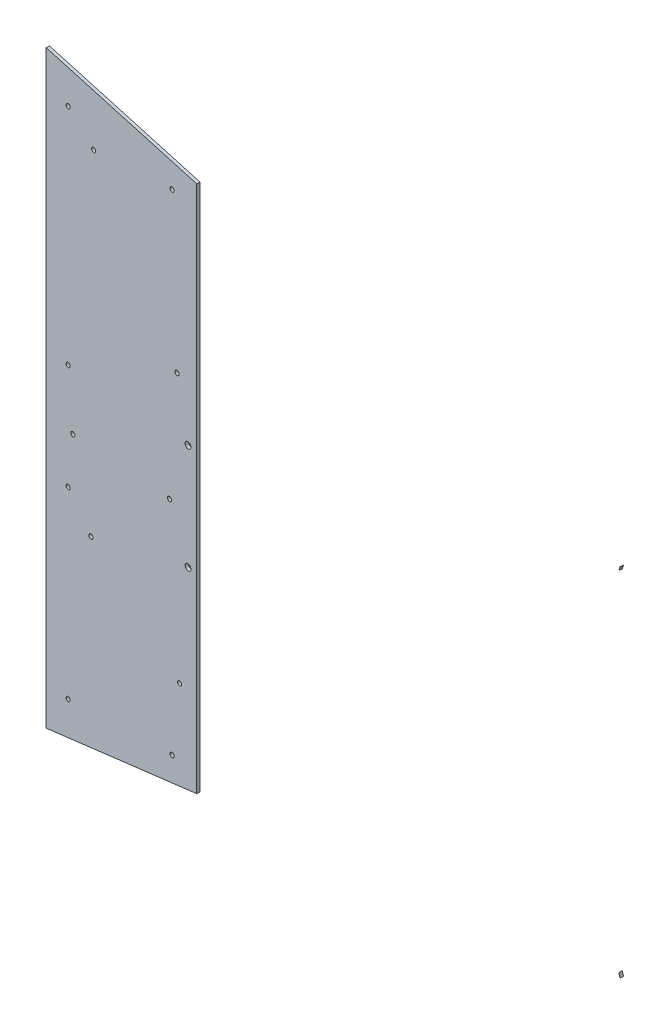
ISO-10303-21;
HEADER;
FILE_DESCRIPTION(('STEP AP214'),'2;1');
FILE_NAME('part.step','',(''),(''),'','','');
FILE_SCHEMA(('AUTOMOTIVE_DESIGN { 1 0 10303 214 1 1 1 1 }'));
ENDSEC;
DATA;
#1=APPLICATION_CONTEXT('core data for automotive mechanical design processes');
#2=APPLICATION_PROTOCOL_DEFINITION('international standard','automotive_design',2000,#1);
#3=PRODUCT_CONTEXT('',#1,'mechanical');
#4=PRODUCT('Part','Part','',(#3));
#5=PRODUCT_RELATED_PRODUCT_CATEGORY('part','',(#4));
#6=PRODUCT_DEFINITION_FORMATION('','',#4);
#7=PRODUCT_DEFINITION_CONTEXT('part definition',#1,'design');
#8=PRODUCT_DEFINITION('design','',#6,#7);
#9=PRODUCT_DEFINITION_SHAPE('','',#8);
#10=(LENGTH_UNIT() NAMED_UNIT(*) SI_UNIT(.MILLI.,.METRE.));
#11=(NAMED_UNIT(*) PLANE_ANGLE_UNIT() SI_UNIT($,.RADIAN.));
#12=(NAMED_UNIT(*) SI_UNIT($,.STERADIAN.) SOLID_ANGLE_UNIT());
#13=UNCERTAINTY_MEASURE_WITH_UNIT(LENGTH_MEASURE(1.E-05),#10,'distance_accuracy_value','');
#14=(GEOMETRIC_REPRESENTATION_CONTEXT(3) GLOBAL_UNCERTAINTY_ASSIGNED_CONTEXT((#13)) GLOBAL_UNIT_ASSIGNED_CONTEXT((#10,
#11,#12)) REPRESENTATION_CONTEXT('',''));
#15=CARTESIAN_POINT('',(0.,0.,0.));
#16=DIRECTION('',(0.,0.,1.));
#17=DIRECTION('',(1.,0.,0.));
#18=AXIS2_PLACEMENT_3D('',#15,#16,#17);
#19=CARTESIAN_POINT('',(2.18546483713156,0.,-29.4309264733717));
#20=DIRECTION('',(-0.0740535347134658,0.,0.99725426747467));
#21=DIRECTION('',(0.997254267474671,0.,0.0740535347134658));
#22=AXIS2_PLACEMENT_3D('',#19,#20,#21);
#23=PLANE('',#22);
#24=CARTESIAN_POINT('',(340.473432525948,33.,-4.31053283311297));
#25=DIRECTION('',(-0.0740535347134658,0.,0.99725426747467));
#26=DIRECTION('',(0.997254267474671,0.,0.0740535347134658));
#27=AXIS2_PLACEMENT_3D('',#24,#25,#26);
#28=CIRCLE('',#27,3.17499999999997);
#29=CARTESIAN_POINT('',(343.63971482518,33.,-4.07541286039772));
#30=VERTEX_POINT('',#29);
#31=EDGE_CURVE('E390',#30,#30,#28,.T.);
#32=ORIENTED_EDGE('',*,*,#31,.T.);
#33=EDGE_LOOP('',(#32));
#34=FACE_BOUND('',#33,.T.);
#35=CARTESIAN_POINT('',(340.473432525948,-74.,-4.31053283311297));
#36=DIRECTION('',(-0.0740535347134658,0.,0.99725426747467));
#37=DIRECTION('',(0.997254267474671,0.,0.0740535347134658));
#38=AXIS2_PLACEMENT_3D('',#35,#36,#37);
#39=CIRCLE('',#38,3.17499999999997);
#40=CARTESIAN_POINT('',(343.63971482518,-74.,-4.07541286039772));
#41=VERTEX_POINT('',#40);
#42=EDGE_CURVE('E391',#41,#41,#39,.T.);
#43=ORIENTED_EDGE('',*,*,#42,.T.);
#44=EDGE_LOOP('',(#43));
#45=FACE_BOUND('',#44,.T.);
#46=CARTESIAN_POINT('',(323.021224904554,248.051870805116,-5.60648884460266));
#47=DIRECTION('',(0.0740535347134658,0.,-0.997254267474671));
#48=DIRECTION('',(-0.997254267474671,0.,-0.0740535347134658));
#49=AXIS2_PLACEMENT_3D('',#46,#47,#48);
#50=CIRCLE('',#49,2.24999999999997);
#51=CARTESIAN_POINT('',(320.777402802736,248.051870805116,-5.77310929770796));
#52=VERTEX_POINT('',#51);
#53=EDGE_CURVE('E169',#52,#52,#50,.T.);
#54=ORIENTED_EDGE('',*,*,#53,.F.);
#55=EDGE_LOOP('',(#54));
#56=FACE_BOUND('',#55,.T.);
#57=CARTESIAN_POINT('',(209.334496353029,260.,-14.0485726479337));
#58=DIRECTION('',(0.0740535347134658,0.,-0.997254267474671));
#59=DIRECTION('',(-0.997254267474671,0.,-0.0740535347134658));
#60=AXIS2_PLACEMENT_3D('',#57,#58,#59);
#61=CIRCLE('',#60,2.24999999999997);
#62=CARTESIAN_POINT('',(207.090674251211,260.,-14.215193101039));
#63=VERTEX_POINT('',#62);
#64=EDGE_CURVE('E159',#63,#63,#61,.T.);
#65=ORIENTED_EDGE('',*,*,#64,.F.);
#66=EDGE_LOOP('',(#65));
#67=FACE_BOUND('',#66,.T.);
#68=CARTESIAN_POINT('',(209.334496353029,33.,-14.0485726479337));
#69=DIRECTION('',(0.0740535347134658,0.,-0.997254267474671));
#70=DIRECTION('',(-0.997254267474671,0.,-0.0740535347134658));
#71=AXIS2_PLACEMENT_3D('',#68,#69,#70);
#72=CIRCLE('',#71,2.25);
#73=CARTESIAN_POINT('',(207.090674251211,33.,-14.215193101039));
#74=VERTEX_POINT('',#73);
#75=EDGE_CURVE('E156',#74,#74,#72,.T.);
#76=ORIENTED_EDGE('',*,*,#75,.F.);
#77=EDGE_LOOP('',(#76));
#78=FACE_BOUND('',#77,.T.);
#79=CARTESIAN_POINT('',(209.334496353029,-260.,-14.0485726479337));
#80=DIRECTION('',(0.0740535347134658,0.,-0.997254267474671));
#81=DIRECTION('',(-0.997254267474671,0.,-0.0740535347134658));
#82=AXIS2_PLACEMENT_3D('',#79,#80,#81);
#83=CIRCLE('',#82,2.24999999999997);
#84=CARTESIAN_POINT('',(207.090674251211,-260.,-14.215193101039));
#85=VERTEX_POINT('',#84);
#86=EDGE_CURVE('E153',#85,#85,#83,.T.);
#87=ORIENTED_EDGE('',*,*,#86,.F.);
#88=EDGE_LOOP('',(#87));
#89=FACE_BOUND('',#88,.T.);
#90=CARTESIAN_POINT('',(209.334496353029,-74.,-14.0485726479337));
#91=DIRECTION('',(0.0740535347134658,0.,-0.997254267474671));
#92=DIRECTION('',(-0.997254267474671,0.,-0.0740535347134658));
#93=AXIS2_PLACEMENT_3D('',#90,#91,#92);
#94=CIRCLE('',#93,2.25);
#95=CARTESIAN_POINT('',(207.090674251211,-74.,-14.215193101039));
#96=VERTEX_POINT('',#95);
#97=EDGE_CURVE('E149',#96,#96,#94,.T.);
#98=ORIENTED_EDGE('',*,*,#97,.F.);
#99=EDGE_LOOP('',(#98));
#100=FACE_BOUND('',#99,.T.);
#101=CARTESIAN_POINT('',(323.021224904554,-248.051870805116,-5.60648884460266));
#102=DIRECTION('',(0.0740535347134658,0.,-0.997254267474671));
#103=DIRECTION('',(-0.997254267474671,0.,-0.0740535347134658));
#104=AXIS2_PLACEMENT_3D('',#101,#102,#103);
#105=CIRCLE('',#104,2.25);
#106=CARTESIAN_POINT('',(320.777402802736,-248.051870805116,-5.77310929770796));
#107=VERTEX_POINT('',#106);
#108=EDGE_CURVE('E145',#107,#107,#105,.T.);
#109=ORIENTED_EDGE('',*,*,#108,.F.);
#110=EDGE_LOOP('',(#109));
#111=FACE_BOUND('',#110,.T.);
#112=CARTESIAN_POINT('',(331.286227586838,-180.725,-4.99275102166076));
#113=DIRECTION('',(0.0740535347134658,0.,-0.997254267474671));
#114=DIRECTION('',(-0.997254267474671,0.,-0.0740535347134658));
#115=AXIS2_PLACEMENT_3D('',#112,#113,#114);
#116=CIRCLE('',#115,2.25);
#117=CARTESIAN_POINT('',(329.04240548502,-180.725,-5.15937147476606));
#118=VERTEX_POINT('',#117);
#119=EDGE_CURVE('E141',#118,#118,#116,.T.);
#120=ORIENTED_EDGE('',*,*,#119,.F.);
#121=EDGE_LOOP('',(#120));
#122=FACE_BOUND('',#121,.T.);
#123=CARTESIAN_POINT('',(234.191058969835,-104.,-12.2027882952006));
#124=DIRECTION('',(0.0740535347134658,0.,-0.997254267474671));
#125=DIRECTION('',(-0.997254267474671,0.,-0.0740535347134658));
#126=AXIS2_PLACEMENT_3D('',#123,#124,#125);
#127=CIRCLE('',#126,2.25);
#128=CARTESIAN_POINT('',(231.947236868017,-104.,-12.3694087483059));
#129=VERTEX_POINT('',#128);
#130=EDGE_CURVE('E137',#129,#129,#127,.T.);
#131=ORIENTED_EDGE('',*,*,#130,.F.);
#132=EDGE_LOOP('',(#131));
#133=FACE_BOUND('',#132,.T.);
#134=CARTESIAN_POINT('',(320.204239539525,-25.,-5.81567092616417));
#135=DIRECTION('',(0.0740535347134658,0.,-0.997254267474671));
#136=DIRECTION('',(-0.997254267474671,0.,-0.0740535347134658));
#137=AXIS2_PLACEMENT_3D('',#134,#135,#136);
#138=CIRCLE('',#137,2.25);
#139=CARTESIAN_POINT('',(317.960417437707,-25.,-5.98229137926947));
#140=VERTEX_POINT('',#139);
#141=EDGE_CURVE('E133',#140,#140,#138,.T.);
#142=ORIENTED_EDGE('',*,*,#141,.F.);
#143=EDGE_LOOP('',(#142));
#144=FACE_BOUND('',#143,.T.);
#145=CARTESIAN_POINT('',(214.49528718721,-25.,-13.6653456057915));
#146=DIRECTION('',(0.0740535347134658,0.,-0.997254267474671));
#147=DIRECTION('',(-0.997254267474671,0.,-0.0740535347134658));
#148=AXIS2_PLACEMENT_3D('',#145,#146,#147);
#149=CIRCLE('',#148,2.25);
#150=CARTESIAN_POINT('',(212.251465085392,-25.,-13.8319660588968));
#151=VERTEX_POINT('',#150);
#152=EDGE_CURVE('E129',#151,#151,#149,.T.);
#153=ORIENTED_EDGE('',*,*,#152,.F.);
#154=EDGE_LOOP('',(#153));
#155=FACE_BOUND('',#154,.T.);
#156=CARTESIAN_POINT('',(237.182821772259,236.6,-11.9806276910602));
#157=DIRECTION('',(0.0740535347134658,0.,-0.997254267474671));
#158=DIRECTION('',(-0.997254267474671,0.,-0.0740535347134658));
#159=AXIS2_PLACEMENT_3D('',#156,#157,#158);
#160=CIRCLE('',#159,2.25);
#161=CARTESIAN_POINT('',(234.938999670441,236.6,-12.1472481441655));
#162=VERTEX_POINT('',#161);
#163=EDGE_CURVE('E125',#162,#162,#160,.T.);
#164=ORIENTED_EDGE('',*,*,#163,.F.);
#165=EDGE_LOOP('',(#164));
#166=FACE_BOUND('',#165,.T.);
#167=DIRECTION('',(0.980155318065139,-0.184385653893442,0.0727838107474114));
#168=VECTOR('',#167,1.);
#169=CARTESIAN_POINT('',(826.675599863577,177.8,31.7935885038397));
#170=LINE('',#169,#168);
#171=CARTESIAN_POINT('',(185.325599863576,298.45,-15.8314114961604));
#172=VERTEX_POINT('',#171);
#173=CARTESIAN_POINT('',(349.972279423644,267.476862260977,-3.60517291496721));
#174=VERTEX_POINT('',#173);
#175=EDGE_CURVE('E111',#172,#174,#170,.T.);
#176=ORIENTED_EDGE('',*,*,#175,.T.);
#177=DIRECTION('',(0.,-1.,0.));
#178=VECTOR('',#177,1.);
#179=CARTESIAN_POINT('',(349.972279423644,0.,-3.6051729149672));
#180=LINE('',#179,#178);
#181=CARTESIAN_POINT('',(349.972279423644,-267.476862260977,-3.6051729149672));
#182=VERTEX_POINT('',#181);
#183=EDGE_CURVE('E69',#174,#182,#180,.T.);
#184=ORIENTED_EDGE('',*,*,#183,.T.);
#185=DIRECTION('',(-0.980155318065139,-0.184385653893442,-0.0727838107474114));
#186=VECTOR('',#185,1.);
#187=CARTESIAN_POINT('',(185.325599863576,-298.45,-15.8314114961604));
#188=LINE('',#187,#186);
#189=CARTESIAN_POINT('',(185.325599863576,-298.45,-15.8314114961604));
#190=VERTEX_POINT('',#189);
#191=EDGE_CURVE('E98',#182,#190,#188,.T.);
#192=ORIENTED_EDGE('',*,*,#191,.T.);
#193=DIRECTION('',(0.,1.,0.));
#194=VECTOR('',#193,1.);
#195=CARTESIAN_POINT('',(185.325599863576,-298.45,-15.8314114961604));
#196=LINE('',#195,#194);
#197=EDGE_CURVE('E99',#190,#172,#196,.T.);
#198=ORIENTED_EDGE('',*,*,#197,.T.);
#199=EDGE_LOOP('',(#176,#184,#192,#198));
#200=FACE_BOUND('',#199,.T.);
#201=CARTESIAN_POINT('',(328.431587246192,90.,-5.20472926477805));
#202=DIRECTION('',(0.0740535347134658,0.,-0.997254267474671));
#203=DIRECTION('',(-0.997254267474671,0.,-0.0740535347134658));
#204=AXIS2_PLACEMENT_3D('',#201,#202,#203);
#205=CIRCLE('',#204,2.25);
#206=CARTESIAN_POINT('',(326.187765144374,90.,-5.37134971788335));
#207=VERTEX_POINT('',#206);
#208=EDGE_CURVE('E121',#207,#207,#205,.T.);
#209=ORIENTED_EDGE('',*,*,#208,.F.);
#210=EDGE_LOOP('',(#209));
#211=FACE_BOUND('',#210,.T.);
#212=ADVANCED_FACE('F50',(#34,#45,#56,#67,#78,#89,#100,#111,#122,#133,#144,#155,#166,#200,#211),
#23,.F.);
#213=CARTESIAN_POINT('',(826.675599863577,177.8,31.7935885038397));
#214=DIRECTION('',(-0.183879380206342,-0.982853972184214,-0.0136544094212631));
#215=DIRECTION('',(0.982945608068834,-0.183896524105788,0.));
#216=AXIS2_PLACEMENT_3D('',#213,#214,#215);
#217=PLANE('',#216);
#218=DIRECTION('',(0.980155318065139,-0.184385653893442,0.0727838107474114));
#219=VECTOR('',#218,1.);
#220=CARTESIAN_POINT('',(826.440479890861,177.8,34.9598708030718));
#221=LINE('',#220,#219);
#222=CARTESIAN_POINT('',(185.090479890861,298.45,-12.6651291969283));
#223=VERTEX_POINT('',#222);
#224=CARTESIAN_POINT('',(349.737159450929,267.476862260977,-0.438890615735127));
#225=VERTEX_POINT('',#224);
#226=EDGE_CURVE('E120',#223,#225,#221,.T.);
#227=ORIENTED_EDGE('',*,*,#226,.T.);
#228=DIRECTION('',(-0.0740535347134658,0.,0.99725426747467));
#229=VECTOR('',#228,1.);
#230=CARTESIAN_POINT('',(353.489395366027,267.476862260977,-50.9690009390479));
#231=LINE('',#230,#229);
#232=EDGE_CURVE('E60',#174,#225,#231,.T.);
#233=ORIENTED_EDGE('',*,*,#232,.F.);
#234=ORIENTED_EDGE('',*,*,#175,.F.);
#235=DIRECTION('',(-0.0740535347134658,0.,0.99725426747467));
#236=VECTOR('',#235,1.);
#237=CARTESIAN_POINT('',(185.325599863576,298.45,-15.8314114961604));
#238=LINE('',#237,#236);
#239=EDGE_CURVE('E115',#172,#223,#238,.T.);
#240=ORIENTED_EDGE('',*,*,#239,.T.);
#241=EDGE_LOOP('',(#227,#233,#234,#240));
#242=FACE_BOUND('',#241,.T.);
#243=ADVANCED_FACE('F194',(#242),#217,.F.);
#244=CARTESIAN_POINT('',(185.325599863576,-298.45,-15.8314114961604));
#245=DIRECTION('',(-0.183879380206342,0.982853972184214,-0.0136544094212631));
#246=DIRECTION('',(-0.982945608068834,-0.183896524105788,0.));
#247=AXIS2_PLACEMENT_3D('',#244,#245,#246);
#248=PLANE('',#247);
#249=ORIENTED_EDGE('',*,*,#191,.F.);
#250=DIRECTION('',(-0.0740535347134658,0.,0.99725426747467));
#251=VECTOR('',#250,1.);
#252=CARTESIAN_POINT('',(353.489395366027,-267.476862260977,-50.9690009390479));
#253=LINE('',#252,#251);
#254=CARTESIAN_POINT('',(349.737159450929,-267.476862260977,-0.438890615735142));
#255=VERTEX_POINT('',#254);
#256=EDGE_CURVE('E88',#182,#255,#253,.T.);
#257=ORIENTED_EDGE('',*,*,#256,.T.);
#258=DIRECTION('',(-0.980155318065139,-0.184385653893442,-0.0727838107474114));
#259=VECTOR('',#258,1.);
#260=CARTESIAN_POINT('',(185.090479890861,-298.45,-12.6651291969283));
#261=LINE('',#260,#259);
#262=CARTESIAN_POINT('',(185.090479890861,-298.45,-12.6651291969283));
#263=VERTEX_POINT('',#262);
#264=EDGE_CURVE('E96',#255,#263,#261,.T.);
#265=ORIENTED_EDGE('',*,*,#264,.T.);
#266=DIRECTION('',(-0.0740535347134658,0.,0.99725426747467));
#267=VECTOR('',#266,1.);
#268=CARTESIAN_POINT('',(185.325599863576,-298.45,-15.8314114961604));
#269=LINE('',#268,#267);
#270=EDGE_CURVE('E105',#190,#263,#269,.T.);
#271=ORIENTED_EDGE('',*,*,#270,.F.);
#272=EDGE_LOOP('',(#249,#257,#265,#271));
#273=FACE_BOUND('',#272,.T.);
#274=ADVANCED_FACE('F52',(#273),#248,.F.);
#275=CARTESIAN_POINT('',(185.325599863576,-298.45,-15.8314114961604));
#276=DIRECTION('',(0.99725426747467,0.,0.0740535347134658));
#277=DIRECTION('',(0.0740535347134658,0.,-0.99725426747467));
#278=AXIS2_PLACEMENT_3D('',#275,#276,#277);
#279=PLANE('',#278);
#280=DIRECTION('',(0.,1.,0.));
#281=VECTOR('',#280,1.);
#282=CARTESIAN_POINT('',(185.090479890861,-298.45,-12.6651291969283));
#283=LINE('',#282,#281);
#284=EDGE_CURVE('E102',#263,#223,#283,.T.);
#285=ORIENTED_EDGE('',*,*,#284,.T.);
#286=ORIENTED_EDGE('',*,*,#239,.F.);
#287=ORIENTED_EDGE('',*,*,#197,.F.);
#288=ORIENTED_EDGE('',*,*,#270,.T.);
#289=EDGE_LOOP('',(#285,#286,#287,#288));
#290=FACE_BOUND('',#289,.T.);
#291=ADVANCED_FACE('F199',(#290),#279,.F.);
#292=CARTESIAN_POINT('',(1.95034486441631,0.,-26.2646441741396));
#293=DIRECTION('',(-0.0740535347134658,0.,0.99725426747467));
#294=DIRECTION('',(0.997254267474671,0.,0.0740535347134658));
#295=AXIS2_PLACEMENT_3D('',#292,#293,#294);
#296=PLANE('',#295);
#297=CARTESIAN_POINT('',(340.238312553233,33.,-1.1442505338809));
#298=DIRECTION('',(-0.0740535347134658,0.,0.997254267474671));
#299=DIRECTION('',(0.997254267474671,0.,0.0740535347134658));
#300=AXIS2_PLACEMENT_3D('',#297,#298,#299);
#301=CIRCLE('',#300,3.17499999999997);
#302=CARTESIAN_POINT('',(343.404594852465,33.,-0.909130561165653));
#303=VERTEX_POINT('',#302);
#304=EDGE_CURVE('E387',#303,#303,#301,.T.);
#305=ORIENTED_EDGE('',*,*,#304,.F.);
#306=EDGE_LOOP('',(#305));
#307=FACE_BOUND('',#306,.T.);
#308=CARTESIAN_POINT('',(340.238312553233,-74.,-1.1442505338809));
#309=DIRECTION('',(-0.0740535347134658,0.,0.997254267474671));
#310=DIRECTION('',(0.997254267474671,0.,0.0740535347134658));
#311=AXIS2_PLACEMENT_3D('',#308,#309,#310);
#312=CIRCLE('',#311,3.17499999999997);
#313=CARTESIAN_POINT('',(343.404594852465,-74.,-0.909130561165653));
#314=VERTEX_POINT('',#313);
#315=EDGE_CURVE('E396',#314,#314,#312,.T.);
#316=ORIENTED_EDGE('',*,*,#315,.F.);
#317=EDGE_LOOP('',(#316));
#318=FACE_BOUND('',#317,.T.);
#319=CARTESIAN_POINT('',(322.786104931838,248.051870805116,-2.44020654537057));
#320=DIRECTION('',(-0.0740535347134658,0.,0.99725426747467));
#321=DIRECTION('',(0.997254267474671,0.,0.0740535347134658));
#322=AXIS2_PLACEMENT_3D('',#319,#320,#321);
#323=CIRCLE('',#322,2.24999999999997);
#324=CARTESIAN_POINT('',(325.029927033656,248.051870805116,-2.27358609226528));
#325=VERTEX_POINT('',#324);
#326=EDGE_CURVE('E54',#325,#325,#323,.T.);
#327=ORIENTED_EDGE('',*,*,#326,.F.);
#328=EDGE_LOOP('',(#327));
#329=FACE_BOUND('',#328,.T.);
#330=CARTESIAN_POINT('',(209.099376380314,260.,-10.8822903487016));
#331=DIRECTION('',(-0.0740535347134658,0.,0.99725426747467));
#332=DIRECTION('',(0.997254267474671,0.,0.0740535347134658));
#333=AXIS2_PLACEMENT_3D('',#330,#331,#332);
#334=CIRCLE('',#333,2.24999999999997);
#335=CARTESIAN_POINT('',(211.343198482132,260.,-10.7156698955963));
#336=VERTEX_POINT('',#335);
#337=EDGE_CURVE('E157',#336,#336,#334,.T.);
#338=ORIENTED_EDGE('',*,*,#337,.F.);
#339=EDGE_LOOP('',(#338));
#340=FACE_BOUND('',#339,.T.);
#341=CARTESIAN_POINT('',(209.099376380314,33.,-10.8822903487016));
#342=DIRECTION('',(-0.0740535347134658,0.,0.99725426747467));
#343=DIRECTION('',(0.997254267474671,0.,0.0740535347134658));
#344=AXIS2_PLACEMENT_3D('',#341,#342,#343);
#345=CIRCLE('',#344,2.25);
#346=CARTESIAN_POINT('',(211.343198482132,33.,-10.7156698955963));
#347=VERTEX_POINT('',#346);
#348=EDGE_CURVE('E154',#347,#347,#345,.T.);
#349=ORIENTED_EDGE('',*,*,#348,.F.);
#350=EDGE_LOOP('',(#349));
#351=FACE_BOUND('',#350,.T.);
#352=CARTESIAN_POINT('',(209.099376380314,-260.,-10.8822903487016));
#353=DIRECTION('',(-0.0740535347134658,0.,0.99725426747467));
#354=DIRECTION('',(0.997254267474671,0.,0.0740535347134658));
#355=AXIS2_PLACEMENT_3D('',#352,#353,#354);
#356=CIRCLE('',#355,2.24999999999997);
#357=CARTESIAN_POINT('',(211.343198482132,-260.,-10.7156698955963));
#358=VERTEX_POINT('',#357);
#359=EDGE_CURVE('E150',#358,#358,#356,.T.);
#360=ORIENTED_EDGE('',*,*,#359,.F.);
#361=EDGE_LOOP('',(#360));
#362=FACE_BOUND('',#361,.T.);
#363=CARTESIAN_POINT('',(209.099376380314,-74.,-10.8822903487016));
#364=DIRECTION('',(-0.0740535347134658,0.,0.99725426747467));
#365=DIRECTION('',(0.997254267474671,0.,0.0740535347134658));
#366=AXIS2_PLACEMENT_3D('',#363,#364,#365);
#367=CIRCLE('',#366,2.25);
#368=CARTESIAN_POINT('',(211.343198482132,-74.,-10.7156698955963));
#369=VERTEX_POINT('',#368);
#370=EDGE_CURVE('E146',#369,#369,#367,.T.);
#371=ORIENTED_EDGE('',*,*,#370,.F.);
#372=EDGE_LOOP('',(#371));
#373=FACE_BOUND('',#372,.T.);
#374=CARTESIAN_POINT('',(322.786104931838,-248.051870805116,-2.44020654537057));
#375=DIRECTION('',(-0.0740535347134658,0.,0.99725426747467));
#376=DIRECTION('',(0.997254267474671,0.,0.0740535347134658));
#377=AXIS2_PLACEMENT_3D('',#374,#375,#376);
#378=CIRCLE('',#377,2.25);
#379=CARTESIAN_POINT('',(325.029927033656,-248.051870805116,-2.27358609226527));
#380=VERTEX_POINT('',#379);
#381=EDGE_CURVE('E142',#380,#380,#378,.T.);
#382=ORIENTED_EDGE('',*,*,#381,.F.);
#383=EDGE_LOOP('',(#382));
#384=FACE_BOUND('',#383,.T.);
#385=CARTESIAN_POINT('',(331.051107614123,-180.725,-1.82646872242868));
#386=DIRECTION('',(-0.0740535347134658,0.,0.99725426747467));
#387=DIRECTION('',(0.997254267474671,0.,0.0740535347134658));
#388=AXIS2_PLACEMENT_3D('',#385,#386,#387);
#389=CIRCLE('',#388,2.25);
#390=CARTESIAN_POINT('',(333.294929715941,-180.725,-1.65984826932338));
#391=VERTEX_POINT('',#390);
#392=EDGE_CURVE('E138',#391,#391,#389,.T.);
#393=ORIENTED_EDGE('',*,*,#392,.F.);
#394=EDGE_LOOP('',(#393));
#395=FACE_BOUND('',#394,.T.);
#396=CARTESIAN_POINT('',(233.95593899712,-104.,-9.03650599596849));
#397=DIRECTION('',(-0.0740535347134658,0.,0.99725426747467));
#398=DIRECTION('',(0.997254267474671,0.,0.0740535347134658));
#399=AXIS2_PLACEMENT_3D('',#396,#397,#398);
#400=CIRCLE('',#399,2.25);
#401=CARTESIAN_POINT('',(236.199761098938,-104.,-8.86988554286319));
#402=VERTEX_POINT('',#401);
#403=EDGE_CURVE('E134',#402,#402,#400,.T.);
#404=ORIENTED_EDGE('',*,*,#403,.F.);
#405=EDGE_LOOP('',(#404));
#406=FACE_BOUND('',#405,.T.);
#407=CARTESIAN_POINT('',(319.96911956681,-25.,-2.64938862693208));
#408=DIRECTION('',(-0.0740535347134658,0.,0.99725426747467));
#409=DIRECTION('',(0.997254267474671,0.,0.0740535347134658));
#410=AXIS2_PLACEMENT_3D('',#407,#408,#409);
#411=CIRCLE('',#410,2.25);
#412=CARTESIAN_POINT('',(322.212941668628,-25.,-2.48276817382679));
#413=VERTEX_POINT('',#412);
#414=EDGE_CURVE('E130',#413,#413,#411,.T.);
#415=ORIENTED_EDGE('',*,*,#414,.F.);
#416=EDGE_LOOP('',(#415));
#417=FACE_BOUND('',#416,.T.);
#418=CARTESIAN_POINT('',(214.260167214495,-25.,-10.4990633065595));
#419=DIRECTION('',(-0.0740535347134658,0.,0.99725426747467));
#420=DIRECTION('',(0.997254267474671,0.,0.0740535347134658));
#421=AXIS2_PLACEMENT_3D('',#418,#419,#420);
#422=CIRCLE('',#421,2.25);
#423=CARTESIAN_POINT('',(216.503989316313,-25.,-10.3324428534542));
#424=VERTEX_POINT('',#423);
#425=EDGE_CURVE('E126',#424,#424,#422,.T.);
#426=ORIENTED_EDGE('',*,*,#425,.F.);
#427=EDGE_LOOP('',(#426));
#428=FACE_BOUND('',#427,.T.);
#429=CARTESIAN_POINT('',(236.947701799544,236.6,-8.81434539182809));
#430=DIRECTION('',(-0.0740535347134658,0.,0.99725426747467));
#431=DIRECTION('',(0.997254267474671,0.,0.0740535347134658));
#432=AXIS2_PLACEMENT_3D('',#429,#430,#431);
#433=CIRCLE('',#432,2.25);
#434=CARTESIAN_POINT('',(239.191523901362,236.6,-8.64772493872279));
#435=VERTEX_POINT('',#434);
#436=EDGE_CURVE('E122',#435,#435,#433,.T.);
#437=ORIENTED_EDGE('',*,*,#436,.F.);
#438=EDGE_LOOP('',(#437));
#439=FACE_BOUND('',#438,.T.);
#440=CARTESIAN_POINT('',(328.196467273476,90.,-2.03844696554597));
#441=DIRECTION('',(-0.0740535347134658,0.,0.99725426747467));
#442=DIRECTION('',(0.997254267474671,0.,0.0740535347134658));
#443=AXIS2_PLACEMENT_3D('',#440,#441,#442);
#444=CIRCLE('',#443,2.25);
#445=CARTESIAN_POINT('',(330.440289375294,90.,-1.87182651244067));
#446=VERTEX_POINT('',#445);
#447=EDGE_CURVE('E117',#446,#446,#444,.T.);
#448=ORIENTED_EDGE('',*,*,#447,.F.);
#449=EDGE_LOOP('',(#448));
#450=FACE_BOUND('',#449,.T.);
#451=DIRECTION('',(0.,-1.,0.));
#452=VECTOR('',#451,1.);
#453=CARTESIAN_POINT('',(349.737159450929,0.,-0.438890615735141));
#454=LINE('',#453,#452);
#455=EDGE_CURVE('E12',#225,#255,#454,.T.);
#456=ORIENTED_EDGE('',*,*,#455,.F.);
#457=ORIENTED_EDGE('',*,*,#226,.F.);
#458=ORIENTED_EDGE('',*,*,#284,.F.);
#459=ORIENTED_EDGE('',*,*,#264,.F.);
#460=EDGE_LOOP('',(#456,#457,#458,#459));
#461=FACE_BOUND('',#460,.T.);
#462=ADVANCED_FACE('F101',(#307,#318,#329,#340,#351,#362,#373,#384,#395,#406,#417,#428,#439,
#450,#461),#296,.T.);
#463=CARTESIAN_POINT('',(353.489395366027,0.,-50.9690009390479));
#464=DIRECTION('',(-0.99725426747467,0.,-0.0740535347134658));
#465=DIRECTION('',(-0.0740535347134658,0.,0.997254267474671));
#466=AXIS2_PLACEMENT_3D('',#463,#464,#465);
#467=PLANE('',#466);
#468=ORIENTED_EDGE('',*,*,#232,.T.);
#469=ORIENTED_EDGE('',*,*,#455,.T.);
#470=ORIENTED_EDGE('',*,*,#256,.F.);
#471=ORIENTED_EDGE('',*,*,#183,.F.);
#472=EDGE_LOOP('',(#468,#469,#470,#471));
#473=FACE_BOUND('',#472,.T.);
#474=ADVANCED_FACE('F87',(#473),#467,.F.);
#475=CARTESIAN_POINT('',(328.431587246192,90.,-5.20472926477805));
#476=DIRECTION('',(0.0740535347134658,0.,-0.997254267474671));
#477=DIRECTION('',(-0.997254267474671,0.,-0.0740535347134658));
#478=AXIS2_PLACEMENT_3D('',#475,#476,#477);
#479=CYLINDRICAL_SURFACE('',#478,2.25);
#480=ORIENTED_EDGE('',*,*,#447,.T.);
#481=EDGE_LOOP('',(#480));
#482=FACE_BOUND('',#481,.T.);
#483=ORIENTED_EDGE('',*,*,#208,.T.);
#484=EDGE_LOOP('',(#483));
#485=FACE_BOUND('',#484,.T.);
#486=ADVANCED_FACE('F206',(#482,#485),#479,.F.);
#487=CARTESIAN_POINT('',(237.182821772259,236.6,-11.9806276910602));
#488=DIRECTION('',(0.0740535347134658,0.,-0.997254267474671));
#489=DIRECTION('',(-0.997254267474671,0.,-0.0740535347134658));
#490=AXIS2_PLACEMENT_3D('',#487,#488,#489);
#491=CYLINDRICAL_SURFACE('',#490,2.25);
#492=ORIENTED_EDGE('',*,*,#436,.T.);
#493=EDGE_LOOP('',(#492));
#494=FACE_BOUND('',#493,.T.);
#495=ORIENTED_EDGE('',*,*,#163,.T.);
#496=EDGE_LOOP('',(#495));
#497=FACE_BOUND('',#496,.T.);
#498=ADVANCED_FACE('F208',(#494,#497),#491,.F.);
#499=CARTESIAN_POINT('',(214.49528718721,-25.,-13.6653456057915));
#500=DIRECTION('',(0.0740535347134658,0.,-0.997254267474671));
#501=DIRECTION('',(-0.997254267474671,0.,-0.0740535347134658));
#502=AXIS2_PLACEMENT_3D('',#499,#500,#501);
#503=CYLINDRICAL_SURFACE('',#502,2.25);
#504=ORIENTED_EDGE('',*,*,#425,.T.);
#505=EDGE_LOOP('',(#504));
#506=FACE_BOUND('',#505,.T.);
#507=ORIENTED_EDGE('',*,*,#152,.T.);
#508=EDGE_LOOP('',(#507));
#509=FACE_BOUND('',#508,.T.);
#510=ADVANCED_FACE('F215',(#506,#509),#503,.F.);
#511=CARTESIAN_POINT('',(320.204239539525,-25.,-5.81567092616417));
#512=DIRECTION('',(0.0740535347134658,0.,-0.997254267474671));
#513=DIRECTION('',(-0.997254267474671,0.,-0.0740535347134658));
#514=AXIS2_PLACEMENT_3D('',#511,#512,#513);
#515=CYLINDRICAL_SURFACE('',#514,2.25);
#516=ORIENTED_EDGE('',*,*,#414,.T.);
#517=EDGE_LOOP('',(#516));
#518=FACE_BOUND('',#517,.T.);
#519=ORIENTED_EDGE('',*,*,#141,.T.);
#520=EDGE_LOOP('',(#519));
#521=FACE_BOUND('',#520,.T.);
#522=ADVANCED_FACE('F274',(#518,#521),#515,.F.);
#523=CARTESIAN_POINT('',(234.191058969835,-104.,-12.2027882952006));
#524=DIRECTION('',(0.0740535347134658,0.,-0.997254267474671));
#525=DIRECTION('',(-0.997254267474671,0.,-0.0740535347134658));
#526=AXIS2_PLACEMENT_3D('',#523,#524,#525);
#527=CYLINDRICAL_SURFACE('',#526,2.25);
#528=ORIENTED_EDGE('',*,*,#403,.T.);
#529=EDGE_LOOP('',(#528));
#530=FACE_BOUND('',#529,.T.);
#531=ORIENTED_EDGE('',*,*,#130,.T.);
#532=EDGE_LOOP('',(#531));
#533=FACE_BOUND('',#532,.T.);
#534=ADVANCED_FACE('F283',(#530,#533),#527,.F.);
#535=CARTESIAN_POINT('',(331.286227586838,-180.725,-4.99275102166076));
#536=DIRECTION('',(0.0740535347134658,0.,-0.997254267474671));
#537=DIRECTION('',(-0.997254267474671,0.,-0.0740535347134658));
#538=AXIS2_PLACEMENT_3D('',#535,#536,#537);
#539=CYLINDRICAL_SURFACE('',#538,2.25);
#540=ORIENTED_EDGE('',*,*,#392,.T.);
#541=EDGE_LOOP('',(#540));
#542=FACE_BOUND('',#541,.T.);
#543=ORIENTED_EDGE('',*,*,#119,.T.);
#544=EDGE_LOOP('',(#543));
#545=FACE_BOUND('',#544,.T.);
#546=ADVANCED_FACE('F293',(#542,#545),#539,.F.);
#547=CARTESIAN_POINT('',(323.021224904554,-248.051870805116,-5.60648884460266));
#548=DIRECTION('',(0.0740535347134658,0.,-0.997254267474671));
#549=DIRECTION('',(-0.997254267474671,0.,-0.0740535347134658));
#550=AXIS2_PLACEMENT_3D('',#547,#548,#549);
#551=CYLINDRICAL_SURFACE('',#550,2.25);
#552=ORIENTED_EDGE('',*,*,#381,.T.);
#553=EDGE_LOOP('',(#552));
#554=FACE_BOUND('',#553,.T.);
#555=ORIENTED_EDGE('',*,*,#108,.T.);
#556=EDGE_LOOP('',(#555));
#557=FACE_BOUND('',#556,.T.);
#558=ADVANCED_FACE('F303',(#554,#557),#551,.F.);
#559=CARTESIAN_POINT('',(209.334496353029,-74.,-14.0485726479337));
#560=DIRECTION('',(0.0740535347134658,0.,-0.997254267474671));
#561=DIRECTION('',(-0.997254267474671,0.,-0.0740535347134658));
#562=AXIS2_PLACEMENT_3D('',#559,#560,#561);
#563=CYLINDRICAL_SURFACE('',#562,2.25);
#564=ORIENTED_EDGE('',*,*,#370,.T.);
#565=EDGE_LOOP('',(#564));
#566=FACE_BOUND('',#565,.T.);
#567=ORIENTED_EDGE('',*,*,#97,.T.);
#568=EDGE_LOOP('',(#567));
#569=FACE_BOUND('',#568,.T.);
#570=ADVANCED_FACE('F313',(#566,#569),#563,.F.);
#571=CARTESIAN_POINT('',(209.334496353029,-260.,-14.0485726479337));
#572=DIRECTION('',(0.0740535347134658,0.,-0.997254267474671));
#573=DIRECTION('',(-0.997254267474671,0.,-0.0740535347134658));
#574=AXIS2_PLACEMENT_3D('',#571,#572,#573);
#575=CYLINDRICAL_SURFACE('',#574,2.24999999999997);
#576=ORIENTED_EDGE('',*,*,#359,.T.);
#577=EDGE_LOOP('',(#576));
#578=FACE_BOUND('',#577,.T.);
#579=ORIENTED_EDGE('',*,*,#86,.T.);
#580=EDGE_LOOP('',(#579));
#581=FACE_BOUND('',#580,.T.);
#582=ADVANCED_FACE('F323',(#578,#581),#575,.F.);
#583=CARTESIAN_POINT('',(209.334496353029,33.,-14.0485726479337));
#584=DIRECTION('',(0.0740535347134658,0.,-0.997254267474671));
#585=DIRECTION('',(-0.997254267474671,0.,-0.0740535347134658));
#586=AXIS2_PLACEMENT_3D('',#583,#584,#585);
#587=CYLINDRICAL_SURFACE('',#586,2.25);
#588=ORIENTED_EDGE('',*,*,#348,.T.);
#589=EDGE_LOOP('',(#588));
#590=FACE_BOUND('',#589,.T.);
#591=ORIENTED_EDGE('',*,*,#75,.T.);
#592=EDGE_LOOP('',(#591));
#593=FACE_BOUND('',#592,.T.);
#594=ADVANCED_FACE('F333',(#590,#593),#587,.F.);
#595=CARTESIAN_POINT('',(209.334496353029,260.,-14.0485726479337));
#596=DIRECTION('',(0.0740535347134658,0.,-0.997254267474671));
#597=DIRECTION('',(-0.997254267474671,0.,-0.0740535347134658));
#598=AXIS2_PLACEMENT_3D('',#595,#596,#597);
#599=CYLINDRICAL_SURFACE('',#598,2.24999999999997);
#600=ORIENTED_EDGE('',*,*,#337,.T.);
#601=EDGE_LOOP('',(#600));
#602=FACE_BOUND('',#601,.T.);
#603=ORIENTED_EDGE('',*,*,#64,.T.);
#604=EDGE_LOOP('',(#603));
#605=FACE_BOUND('',#604,.T.);
#606=ADVANCED_FACE('F343',(#602,#605),#599,.F.);
#607=CARTESIAN_POINT('',(323.021224904554,248.051870805116,-5.60648884460266));
#608=DIRECTION('',(0.0740535347134658,0.,-0.997254267474671));
#609=DIRECTION('',(-0.997254267474671,0.,-0.0740535347134658));
#610=AXIS2_PLACEMENT_3D('',#607,#608,#609);
#611=CYLINDRICAL_SURFACE('',#610,2.24999999999997);
#612=ORIENTED_EDGE('',*,*,#326,.T.);
#613=EDGE_LOOP('',(#612));
#614=FACE_BOUND('',#613,.T.);
#615=ORIENTED_EDGE('',*,*,#53,.T.);
#616=EDGE_LOOP('',(#615));
#617=FACE_BOUND('',#616,.T.);
#618=ADVANCED_FACE('F353',(#614,#617),#611,.F.);
#619=CARTESIAN_POINT('',(343.918305070359,-74.,-50.7014830978515));
#620=DIRECTION('',(-0.0740535347134658,0.,0.99725426747467));
#621=DIRECTION('',(0.997254267474671,0.,0.0740535347134658));
#622=AXIS2_PLACEMENT_3D('',#619,#620,#621);
#623=CYLINDRICAL_SURFACE('',#622,3.17499999999997);
#624=ORIENTED_EDGE('',*,*,#315,.T.);
#625=EDGE_LOOP('',(#624));
#626=FACE_BOUND('',#625,.T.);
#627=ORIENTED_EDGE('',*,*,#42,.F.);
#628=EDGE_LOOP('',(#627));
#629=FACE_BOUND('',#628,.T.);
#630=ADVANCED_FACE('F361',(#626,#629),#623,.F.);
#631=CARTESIAN_POINT('',(343.918305070359,33.,-50.7014830978515));
#632=DIRECTION('',(-0.0740535347134658,0.,0.99725426747467));
#633=DIRECTION('',(0.997254267474671,0.,0.0740535347134658));
#634=AXIS2_PLACEMENT_3D('',#631,#632,#633);
#635=CYLINDRICAL_SURFACE('',#634,3.17499999999997);
#636=ORIENTED_EDGE('',*,*,#304,.T.);
#637=EDGE_LOOP('',(#636));
#638=FACE_BOUND('',#637,.T.);
#639=ORIENTED_EDGE('',*,*,#31,.F.);
#640=EDGE_LOOP('',(#639));
#641=FACE_BOUND('',#640,.T.);
#642=ADVANCED_FACE('F371',(#638,#641),#635,.F.);
#643=CLOSED_SHELL('',(#212,#243,#274,#291,#462,#474,#486,#498,#510,#522,#534,#546,#558,#570,
#582,#594,#606,#618,#630,#642));
#644=MANIFOLD_SOLID_BREP('B2',#643);
#645=CARTESIAN_POINT('',(825.5,-109.107616512264,-154.405240752952));
#646=DIRECTION('',(0.,-0.32191156150474,0.946769743163342));
#647=DIRECTION('',(0.,-0.946769743163342,-0.32191156150474));
#648=AXIS2_PLACEMENT_3D('',#645,#646,#647);
#649=CYLINDRICAL_SURFACE('',#648,14.2875);
#650=CARTESIAN_POINT('',(811.954173862243,-175.065535970194,25.4686283116482));
#651=CARTESIAN_POINT('',(811.880977584804,-175.307395956492,26.8579867735654));
#652=CARTESIAN_POINT('',(811.813199189109,-175.548087490953,28.2478389626224));
#653=CARTESIAN_POINT('',(811.688428725382,-176.027121909935,31.0283878845206));
#654=CARTESIAN_POINT('',(811.631436325267,-176.26546486655,32.4190845900373));
#655=CARTESIAN_POINT('',(811.5792404021,-176.505252351927,33.8255262028592));
#656=CARTESIAN_POINT('',(811.578671337429,-176.507869487999,33.8408775521273));
#657=CARTESIAN_POINT('',(811.578102926224,-176.51048648125,33.856228949262));
#658=B_SPLINE_CURVE_WITH_KNOTS('',3,(#650,#651,#652,#653,#654,#655,#656,#657),.UNSPECIFIED.,.F.,
.F.,(4,2,2,4),(0.,4.23645238633917,8.47277431762877,8.51952401747199),.UNSPECIFIED.);
#659=CARTESIAN_POINT('',(811.578102926224,-176.51048648125,33.8562289492621));
#660=VERTEX_POINT('',#659);
#661=CARTESIAN_POINT('',(811.704993942358,-175.967195958501,30.6819098463234));
#662=VERTEX_POINT('',#661);
#663=EDGE_CURVE('E48',#660,#662,#658,.F.);
#664=ORIENTED_EDGE('',*,*,#663,.F.);
#665=CARTESIAN_POINT('',(825.5,-173.469978807462,34.8900331874138));
#666=DIRECTION('',(-0.0740535347134658,0.,0.99725426747467));
#667=DIRECTION('',(0.212224619630727,-0.977093832105223,0.0157592539329748));
#668=AXIS2_PLACEMENT_3D('',#665,#666,#667);
#669=ELLIPSE('',#668,15.1323357845075,14.2875);
#670=CARTESIAN_POINT('',(812.937098512754,-180.340240061228,33.9571444631133));
#671=VERTEX_POINT('',#670);
#672=EDGE_CURVE('E487',#671,#660,#669,.F.);
#673=ORIENTED_EDGE('',*,*,#672,.F.);
#674=CARTESIAN_POINT('',(825.5,-177.8,47.6250000000003));
#675=DIRECTION('',(-0.183879380206342,0.982853972184214,-0.0136544094212631));
#676=DIRECTION('',(-0.0641324979789552,0.00186562054135586,0.997939648557454));
#677=AXIS2_PLACEMENT_3D('',#674,#675,#676);
#678=ELLIPSE('',#677,43.3849012466059,14.2875);
#679=CARTESIAN_POINT('',(813.501935973131,-180.278213999193,30.8153461357374));
#680=VERTEX_POINT('',#679);
#681=EDGE_CURVE('E506',#671,#680,#678,.F.);
#682=ORIENTED_EDGE('',*,*,#681,.T.);
#683=CARTESIAN_POINT('',(825.5,-172.387473509328,31.7062914842672));
#684=DIRECTION('',(-0.0740535347134658,0.,0.99725426747467));
#685=DIRECTION('',(0.212224619630727,-0.977093832105223,0.0157592539329748));
#686=AXIS2_PLACEMENT_3D('',#683,#684,#685);
#687=ELLIPSE('',#686,15.1323357845075,14.2875);
#688=EDGE_CURVE('E509',#680,#662,#687,.F.);
#689=ORIENTED_EDGE('',*,*,#688,.T.);
#690=EDGE_LOOP('',(#664,#673,#682,#689));
#691=FACE_BOUND('',#690,.T.);
#692=ADVANCED_FACE('F477',(#691),#649,.F.);
#693=CARTESIAN_POINT('',(2.18546483713156,0.,-29.4309264733717));
#694=DIRECTION('',(-0.0740535347134658,0.,0.99725426747467));
#695=DIRECTION('',(0.997254267474671,0.,0.0740535347134658));
#696=AXIS2_PLACEMENT_3D('',#693,#694,#695);
#697=PLANE('',#696);
#698=DIRECTION('',(-0.980155318065139,-0.184385653893442,-0.0727838107474114));
#699=VECTOR('',#698,1.);
#700=CARTESIAN_POINT('',(185.325599863576,-298.45,-15.8314114961604));
#701=LINE('',#700,#699);
#702=CARTESIAN_POINT('',(813.172218485469,-180.340240061228,30.7908621638812));
#703=VERTEX_POINT('',#702);
#704=EDGE_CURVE('E517',#680,#703,#701,.T.);
#705=ORIENTED_EDGE('',*,*,#704,.T.);
#706=CARTESIAN_POINT('',(825.735119972715,-173.469978807462,31.7237508881817));
#707=DIRECTION('',(0.0740535347134658,0.,-0.99725426747467));
#708=DIRECTION('',(0.212224619630727,-0.977093832105223,0.0157592539329748));
#709=AXIS2_PLACEMENT_3D('',#706,#707,#708);
#710=ELLIPSE('',#709,15.1323357845075,14.2875);
#711=EDGE_CURVE('E494',#703,#662,#710,.T.);
#712=ORIENTED_EDGE('',*,*,#711,.T.);
#713=ORIENTED_EDGE('',*,*,#688,.F.);
#714=EDGE_LOOP('',(#705,#712,#713));
#715=FACE_BOUND('',#714,.T.);
#716=ADVANCED_FACE('F516',(#715),#697,.F.);
#717=CARTESIAN_POINT('',(185.325599863576,-298.45,-15.8314114961604));
#718=DIRECTION('',(-0.183879380206342,0.982853972184214,-0.0136544094212631));
#719=DIRECTION('',(-0.982945608068834,-0.183896524105788,0.));
#720=AXIS2_PLACEMENT_3D('',#717,#718,#719);
#721=PLANE('',#720);
#722=ORIENTED_EDGE('',*,*,#681,.F.);
#723=DIRECTION('',(-0.0740535347134658,0.,0.99725426747467));
#724=VECTOR('',#723,1.);
#725=CARTESIAN_POINT('',(816.689334427852,-180.340240061228,-16.5729658601994));
#726=LINE('',#725,#724);
#727=EDGE_CURVE('E519',#703,#671,#726,.T.);
#728=ORIENTED_EDGE('',*,*,#727,.F.);
#729=ORIENTED_EDGE('',*,*,#704,.F.);
#730=EDGE_LOOP('',(#722,#728,#729));
#731=FACE_BOUND('',#730,.T.);
#732=ADVANCED_FACE('F479',(#731),#721,.F.);
#733=CARTESIAN_POINT('',(829.252235915097,-173.469978807462,-15.640077135899));
#734=DIRECTION('',(0.0740535347134658,0.,-0.99725426747467));
#735=DIRECTION('',(0.212224619630727,-0.977093832105223,0.0157592539329748));
#736=AXIS2_PLACEMENT_3D('',#733,#734,#735);
#737=ELLIPSE('',#736,15.1323357845075,14.2875);
#738=DIRECTION('',(-0.0740535347134658,0.,0.99725426747467));
#739=VECTOR('',#738,1.);
#740=SURFACE_OF_LINEAR_EXTRUSION('',#737,#739);
#741=ORIENTED_EDGE('',*,*,#727,.T.);
#742=ORIENTED_EDGE('',*,*,#672,.T.);
#743=ORIENTED_EDGE('',*,*,#663,.T.);
#744=ORIENTED_EDGE('',*,*,#711,.F.);
#745=EDGE_LOOP('',(#741,#742,#743,#744));
#746=FACE_BOUND('',#745,.T.);
#747=ADVANCED_FACE('F523',(#746),#740,.F.);
#748=CLOSED_SHELL('',(#692,#716,#732,#747));
#749=MANIFOLD_SOLID_BREP('B6',#748);
#750=CARTESIAN_POINT('',(825.5,109.107616512264,-154.405240752952));
#751=DIRECTION('',(0.,0.32191156150474,0.946769743163342));
#752=DIRECTION('',(0.,-0.946769743163342,0.32191156150474));
#753=AXIS2_PLACEMENT_3D('',#750,#751,#752);
#754=CYLINDRICAL_SURFACE('',#753,14.2875);
#755=CARTESIAN_POINT('',(825.5,173.469978807462,34.8900331874138));
#756=DIRECTION('',(-0.0740535347134658,0.,0.99725426747467));
#757=DIRECTION('',(0.212224619630727,0.977093832105223,0.0157592539329748));
#758=AXIS2_PLACEMENT_3D('',#755,#756,#757);
#759=ELLIPSE('',#758,15.1323357845075,14.2875);
#760=CARTESIAN_POINT('',(812.937098512754,180.340240061228,33.9571444631133));
#761=VERTEX_POINT('',#760);
#762=CARTESIAN_POINT('',(811.578102926224,176.51048648125,33.8562289492621));
#763=VERTEX_POINT('',#762);
#764=EDGE_CURVE('E577',#761,#763,#759,.T.);
#765=ORIENTED_EDGE('',*,*,#764,.T.);
#766=CARTESIAN_POINT('',(811.954173862243,175.065535970194,25.4686283116483));
#767=CARTESIAN_POINT('',(811.880977584592,175.307395955585,26.8579867737121));
#768=CARTESIAN_POINT('',(811.813199189002,175.548087490498,28.2478389626961));
#769=CARTESIAN_POINT('',(811.688428725489,176.027121910392,31.0283878844467));
#770=CARTESIAN_POINT('',(811.631436325481,176.265464867468,32.4190845898889));
#771=CARTESIAN_POINT('',(811.579240402104,176.505252351948,33.825526202856));
#772=CARTESIAN_POINT('',(811.578671337431,176.50786948801,33.8408775521257));
#773=CARTESIAN_POINT('',(811.578102926224,176.51048648125,33.856228949262));
#774=B_SPLINE_CURVE_WITH_KNOTS('',3,(#766,#767,#768,#769,#770,#771,#772,#773),.UNSPECIFIED.,.F.,
.F.,(4,2,2,4),(0.,4.23645238633917,8.47277431762883,8.51952401747204),.UNSPECIFIED.);
#775=CARTESIAN_POINT('',(811.704993942358,175.9671959585,30.6819098463236));
#776=VERTEX_POINT('',#775);
#777=EDGE_CURVE('E475',#763,#776,#774,.F.);
#778=ORIENTED_EDGE('',*,*,#777,.T.);
#779=CARTESIAN_POINT('',(825.5,172.387473509328,31.7062914842672));
#780=DIRECTION('',(-0.0740535347134658,0.,0.99725426747467));
#781=DIRECTION('',(0.212224619630727,0.977093832105223,0.0157592539329748));
#782=AXIS2_PLACEMENT_3D('',#779,#780,#781);
#783=ELLIPSE('',#782,15.1323357845075,14.2875);
#784=CARTESIAN_POINT('',(813.501935973131,180.278213999193,30.8153461357373));
#785=VERTEX_POINT('',#784);
#786=EDGE_CURVE('E608',#785,#776,#783,.T.);
#787=ORIENTED_EDGE('',*,*,#786,.F.);
#788=CARTESIAN_POINT('',(825.5,177.8,47.6250000000001));
#789=DIRECTION('',(-0.183879380206342,-0.982853972184214,-0.0136544094212631));
#790=DIRECTION('',(-0.0641324979789552,-0.00186562054135586,0.997939648557454));
#791=AXIS2_PLACEMENT_3D('',#788,#789,#790);
#792=ELLIPSE('',#791,43.3849012466059,14.2875);
#793=EDGE_CURVE('E605',#761,#785,#792,.T.);
#794=ORIENTED_EDGE('',*,*,#793,.F.);
#795=EDGE_LOOP('',(#765,#778,#787,#794));
#796=FACE_BOUND('',#795,.T.);
#797=ADVANCED_FACE('F563',(#796),#754,.F.);
#798=CARTESIAN_POINT('',(2.18546483713156,0.,-29.4309264733717));
#799=DIRECTION('',(-0.0740535347134658,0.,0.99725426747467));
#800=DIRECTION('',(0.997254267474671,0.,0.0740535347134658));
#801=AXIS2_PLACEMENT_3D('',#798,#799,#800);
#802=PLANE('',#801);
#803=ORIENTED_EDGE('',*,*,#786,.T.);
#804=CARTESIAN_POINT('',(825.735119972715,173.469978807462,31.7237508881817));
#805=DIRECTION('',(0.0740535347134658,0.,-0.99725426747467));
#806=DIRECTION('',(0.212224619630727,0.977093832105223,0.0157592539329748));
#807=AXIS2_PLACEMENT_3D('',#804,#805,#806);
#808=ELLIPSE('',#807,15.1323357845075,14.2875);
#809=CARTESIAN_POINT('',(813.17221848547,180.340240061228,30.7908621638813));
#810=VERTEX_POINT('',#809);
#811=EDGE_CURVE('E606',#776,#810,#808,.T.);
#812=ORIENTED_EDGE('',*,*,#811,.T.);
#813=DIRECTION('',(0.980155318065139,-0.184385653893442,0.0727838107474114));
#814=VECTOR('',#813,1.);
#815=CARTESIAN_POINT('',(826.675599863577,177.8,31.7935885038397));
#816=LINE('',#815,#814);
#817=EDGE_CURVE('E590',#810,#785,#816,.T.);
#818=ORIENTED_EDGE('',*,*,#817,.T.);
#819=EDGE_LOOP('',(#803,#812,#818));
#820=FACE_BOUND('',#819,.T.);
#821=ADVANCED_FACE('F619',(#820),#802,.F.);
#822=CARTESIAN_POINT('',(826.675599863577,177.8,31.7935885038397));
#823=DIRECTION('',(-0.183879380206342,-0.982853972184214,-0.0136544094212631));
#824=DIRECTION('',(0.982945608068834,-0.183896524105788,0.));
#825=AXIS2_PLACEMENT_3D('',#822,#823,#824);
#826=PLANE('',#825);
#827=ORIENTED_EDGE('',*,*,#817,.F.);
#828=DIRECTION('',(-0.0740535347134658,0.,0.99725426747467));
#829=VECTOR('',#828,1.);
#830=CARTESIAN_POINT('',(816.689334427852,180.340240061228,-16.5729658601994));
#831=LINE('',#830,#829);
#832=EDGE_CURVE('E600',#810,#761,#831,.T.);
#833=ORIENTED_EDGE('',*,*,#832,.T.);
#834=ORIENTED_EDGE('',*,*,#793,.T.);
#835=EDGE_LOOP('',(#827,#833,#834));
#836=FACE_BOUND('',#835,.T.);
#837=ADVANCED_FACE('F565',(#836),#826,.F.);
#838=CARTESIAN_POINT('',(829.252235915097,173.469978807462,-15.640077135899));
#839=DIRECTION('',(0.0740535347134658,0.,-0.99725426747467));
#840=DIRECTION('',(0.212224619630727,0.977093832105223,0.0157592539329748));
#841=AXIS2_PLACEMENT_3D('',#838,#839,#840);
#842=ELLIPSE('',#841,15.1323357845075,14.2875);
#843=DIRECTION('',(-0.0740535347134658,0.,0.99725426747467));
#844=VECTOR('',#843,1.);
#845=SURFACE_OF_LINEAR_EXTRUSION('',#842,#844);
#846=ORIENTED_EDGE('',*,*,#777,.F.);
#847=ORIENTED_EDGE('',*,*,#764,.F.);
#848=ORIENTED_EDGE('',*,*,#832,.F.);
#849=ORIENTED_EDGE('',*,*,#811,.F.);
#850=EDGE_LOOP('',(#846,#847,#848,#849));
#851=FACE_BOUND('',#850,.T.);
#852=ADVANCED_FACE('F599',(#851),#845,.F.);
#853=CLOSED_SHELL('',(#797,#821,#837,#852));
#854=MANIFOLD_SOLID_BREP('B42',#853);
#855=ADVANCED_BREP_SHAPE_REPRESENTATION('',(#18,#644,#749,#854),#14);
#856=SHAPE_DEFINITION_REPRESENTATION(#9,#855);
ENDSEC;
END-ISO-10303-21;
